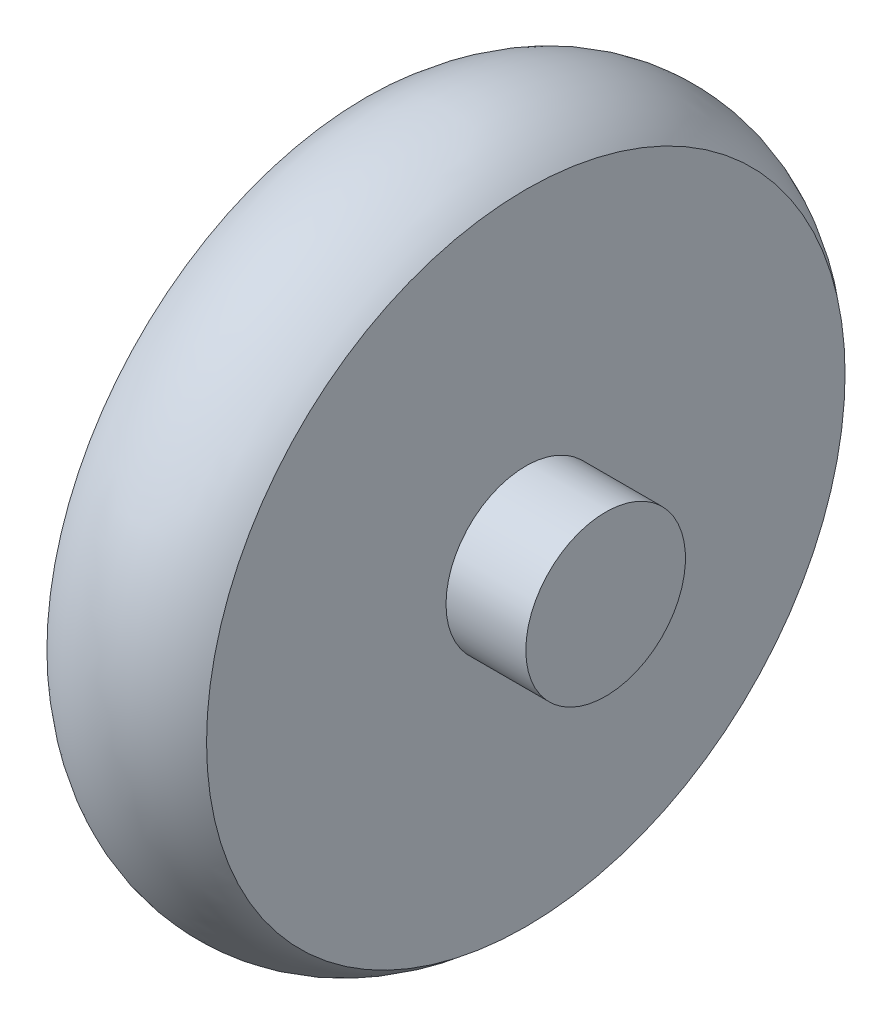
ISO-10303-21;
HEADER;
FILE_DESCRIPTION(('STEP AP214'),'2;1');
FILE_NAME('part.step','',(''),(''),'','','');
FILE_SCHEMA(('AUTOMOTIVE_DESIGN { 1 0 10303 214 1 1 1 1 }'));
ENDSEC;
DATA;
#1=APPLICATION_CONTEXT('core data for automotive mechanical design processes');
#2=APPLICATION_PROTOCOL_DEFINITION('international standard','automotive_design',2000,#1);
#3=PRODUCT_CONTEXT('',#1,'mechanical');
#4=PRODUCT('Part','Part','',(#3));
#5=PRODUCT_RELATED_PRODUCT_CATEGORY('part','',(#4));
#6=PRODUCT_DEFINITION_FORMATION('','',#4);
#7=PRODUCT_DEFINITION_CONTEXT('part definition',#1,'design');
#8=PRODUCT_DEFINITION('design','',#6,#7);
#9=PRODUCT_DEFINITION_SHAPE('','',#8);
#10=(LENGTH_UNIT() NAMED_UNIT(*) SI_UNIT(.MILLI.,.METRE.));
#11=(NAMED_UNIT(*) PLANE_ANGLE_UNIT() SI_UNIT($,.RADIAN.));
#12=(NAMED_UNIT(*) SI_UNIT($,.STERADIAN.) SOLID_ANGLE_UNIT());
#13=UNCERTAINTY_MEASURE_WITH_UNIT(LENGTH_MEASURE(1.E-05),#10,'distance_accuracy_value','');
#14=(GEOMETRIC_REPRESENTATION_CONTEXT(3) GLOBAL_UNCERTAINTY_ASSIGNED_CONTEXT((#13)) GLOBAL_UNIT_ASSIGNED_CONTEXT((#10,
#11,#12)) REPRESENTATION_CONTEXT('',''));
#15=CARTESIAN_POINT('',(0.,0.,0.));
#16=DIRECTION('',(0.,0.,1.));
#17=DIRECTION('',(1.,0.,0.));
#18=AXIS2_PLACEMENT_3D('',#15,#16,#17);
#19=CARTESIAN_POINT('',(-10.,0.,0.));
#20=DIRECTION('',(1.,0.,0.));
#21=DIRECTION('',(0.,0.,-1.));
#22=AXIS2_PLACEMENT_3D('',#19,#20,#21);
#23=PLANE('',#22);
#24=CARTESIAN_POINT('',(-10.,0.,0.));
#25=DIRECTION('',(-1.,0.,0.));
#26=DIRECTION('',(0.,0.,1.));
#27=AXIS2_PLACEMENT_3D('',#24,#25,#26);
#28=CIRCLE('',#27,10.);
#29=CARTESIAN_POINT('',(-10.,0.,10.));
#30=VERTEX_POINT('',#29);
#31=EDGE_CURVE('E55',#30,#30,#28,.T.);
#32=ORIENTED_EDGE('',*,*,#31,.T.);
#33=EDGE_LOOP('',(#32));
#34=FACE_BOUND('',#33,.T.);
#35=ADVANCED_FACE('F33',(#34),#23,.F.);
#36=CARTESIAN_POINT('',(30.,0.,0.));
#37=DIRECTION('',(-1.,0.,0.));
#38=DIRECTION('',(0.,0.,1.));
#39=AXIS2_PLACEMENT_3D('',#36,#37,#38);
#40=PLANE('',#39);
#41=CARTESIAN_POINT('',(30.,0.,0.));
#42=DIRECTION('',(-1.,0.,0.));
#43=DIRECTION('',(0.,0.,1.));
#44=AXIS2_PLACEMENT_3D('',#41,#42,#43);
#45=CIRCLE('',#44,10.);
#46=CARTESIAN_POINT('',(30.,0.,10.));
#47=VERTEX_POINT('',#46);
#48=EDGE_CURVE('E10',#47,#47,#45,.T.);
#49=ORIENTED_EDGE('',*,*,#48,.F.);
#50=EDGE_LOOP('',(#49));
#51=FACE_BOUND('',#50,.T.);
#52=ADVANCED_FACE('F85',(#51),#40,.F.);
#53=CARTESIAN_POINT('',(0.,0.,0.));
#54=DIRECTION('',(-1.,0.,0.));
#55=DIRECTION('',(0.,0.,1.));
#56=AXIS2_PLACEMENT_3D('',#53,#54,#55);
#57=CYLINDRICAL_SURFACE('',#56,10.);
#58=CARTESIAN_POINT('',(20.,0.,0.));
#59=DIRECTION('',(-1.,0.,0.));
#60=DIRECTION('',(0.,0.,1.));
#61=AXIS2_PLACEMENT_3D('',#58,#59,#60);
#62=CIRCLE('',#61,10.);
#63=CARTESIAN_POINT('',(20.,0.,10.));
#64=VERTEX_POINT('',#63);
#65=EDGE_CURVE('E39',#64,#64,#62,.T.);
#66=ORIENTED_EDGE('',*,*,#65,.F.);
#67=EDGE_LOOP('',(#66));
#68=FACE_BOUND('',#67,.T.);
#69=ORIENTED_EDGE('',*,*,#48,.T.);
#70=EDGE_LOOP('',(#69));
#71=FACE_BOUND('',#70,.T.);
#72=ADVANCED_FACE('F80',(#68,#71),#57,.T.);
#73=CARTESIAN_POINT('',(20.,10.,0.));
#74=DIRECTION('',(-1.,0.,0.));
#75=DIRECTION('',(0.,0.,1.));
#76=AXIS2_PLACEMENT_3D('',#73,#74,#75);
#77=PLANE('',#76);
#78=CARTESIAN_POINT('',(20.,0.,0.));
#79=DIRECTION('',(-1.,0.,0.));
#80=DIRECTION('',(0.,0.,1.));
#81=AXIS2_PLACEMENT_3D('',#78,#79,#80);
#82=CIRCLE('',#81,40.);
#83=CARTESIAN_POINT('',(20.,0.,40.));
#84=VERTEX_POINT('',#83);
#85=EDGE_CURVE('E43',#84,#84,#82,.T.);
#86=ORIENTED_EDGE('',*,*,#85,.F.);
#87=EDGE_LOOP('',(#86));
#88=FACE_BOUND('',#87,.T.);
#89=ORIENTED_EDGE('',*,*,#65,.T.);
#90=EDGE_LOOP('',(#89));
#91=FACE_BOUND('',#90,.T.);
#92=ADVANCED_FACE('F75',(#88,#91),#77,.F.);
#93=CARTESIAN_POINT('',(10.,0.,0.));
#94=DIRECTION('',(-1.,0.,0.));
#95=DIRECTION('',(0.,0.,1.));
#96=AXIS2_PLACEMENT_3D('',#93,#94,#95);
#97=TOROIDAL_SURFACE('',#96,28.8196601125011,15.);
#98=CARTESIAN_POINT('',(0.,0.,0.));
#99=DIRECTION('',(-1.,0.,0.));
#100=DIRECTION('',(0.,0.,1.));
#101=AXIS2_PLACEMENT_3D('',#98,#99,#100);
#102=CIRCLE('',#101,40.);
#103=CARTESIAN_POINT('',(0.,0.,40.));
#104=VERTEX_POINT('',#103);
#105=EDGE_CURVE('E47',#104,#104,#102,.T.);
#106=ORIENTED_EDGE('',*,*,#105,.F.);
#107=EDGE_LOOP('',(#106));
#108=FACE_BOUND('',#107,.T.);
#109=ORIENTED_EDGE('',*,*,#85,.T.);
#110=EDGE_LOOP('',(#109));
#111=FACE_BOUND('',#110,.T.);
#112=ADVANCED_FACE('F69',(#108,#111),#97,.T.);
#113=CARTESIAN_POINT('',(0.,10.,0.));
#114=DIRECTION('',(1.,0.,0.));
#115=DIRECTION('',(0.,0.,-1.));
#116=AXIS2_PLACEMENT_3D('',#113,#114,#115);
#117=PLANE('',#116);
#118=CARTESIAN_POINT('',(0.,0.,0.));
#119=DIRECTION('',(-1.,0.,0.));
#120=DIRECTION('',(0.,0.,1.));
#121=AXIS2_PLACEMENT_3D('',#118,#119,#120);
#122=CIRCLE('',#121,10.);
#123=CARTESIAN_POINT('',(0.,0.,10.));
#124=VERTEX_POINT('',#123);
#125=EDGE_CURVE('E52',#124,#124,#122,.T.);
#126=ORIENTED_EDGE('',*,*,#125,.F.);
#127=EDGE_LOOP('',(#126));
#128=FACE_BOUND('',#127,.T.);
#129=ORIENTED_EDGE('',*,*,#105,.T.);
#130=EDGE_LOOP('',(#129));
#131=FACE_BOUND('',#130,.T.);
#132=ADVANCED_FACE('F63',(#128,#131),#117,.F.);
#133=CARTESIAN_POINT('',(0.,0.,0.));
#134=DIRECTION('',(-1.,0.,0.));
#135=DIRECTION('',(0.,0.,1.));
#136=AXIS2_PLACEMENT_3D('',#133,#134,#135);
#137=CYLINDRICAL_SURFACE('',#136,10.);
#138=ORIENTED_EDGE('',*,*,#31,.F.);
#139=EDGE_LOOP('',(#138));
#140=FACE_BOUND('',#139,.T.);
#141=ORIENTED_EDGE('',*,*,#125,.T.);
#142=EDGE_LOOP('',(#141));
#143=FACE_BOUND('',#142,.T.);
#144=ADVANCED_FACE('F60',(#140,#143),#137,.T.);
#145=CLOSED_SHELL('',(#35,#52,#72,#92,#112,#132,#144));
#146=MANIFOLD_SOLID_BREP('B2',#145);
#147=ADVANCED_BREP_SHAPE_REPRESENTATION('',(#18,#146),#14);
#148=SHAPE_DEFINITION_REPRESENTATION(#9,#147);
ENDSEC;
END-ISO-10303-21;
